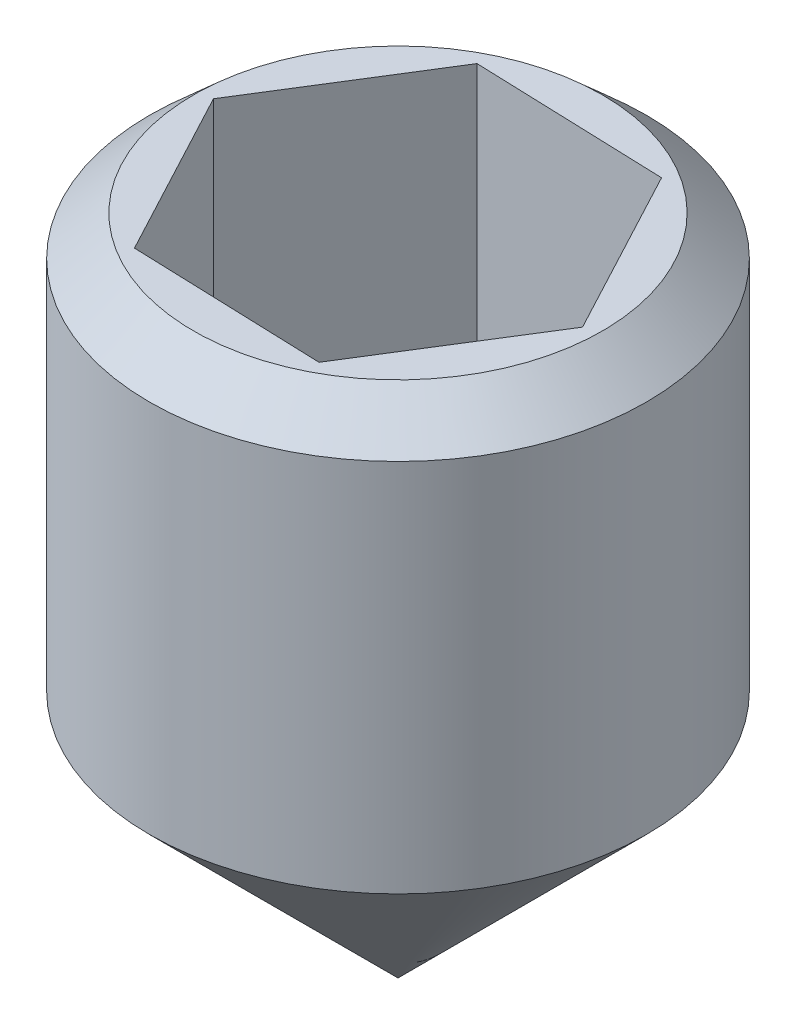
ISO-10303-21;
HEADER;
FILE_DESCRIPTION(('STEP AP214'),'2;1');
FILE_NAME('part.step','',(''),(''),'','','');
FILE_SCHEMA(('AUTOMOTIVE_DESIGN { 1 0 10303 214 1 1 1 1 }'));
ENDSEC;
DATA;
#1=APPLICATION_CONTEXT('core data for automotive mechanical design processes');
#2=APPLICATION_PROTOCOL_DEFINITION('international standard','automotive_design',2000,#1);
#3=PRODUCT_CONTEXT('',#1,'mechanical');
#4=PRODUCT('Part','Part','',(#3));
#5=PRODUCT_RELATED_PRODUCT_CATEGORY('part','',(#4));
#6=PRODUCT_DEFINITION_FORMATION('','',#4);
#7=PRODUCT_DEFINITION_CONTEXT('part definition',#1,'design');
#8=PRODUCT_DEFINITION('design','',#6,#7);
#9=PRODUCT_DEFINITION_SHAPE('','',#8);
#10=(LENGTH_UNIT() NAMED_UNIT(*) SI_UNIT(.MILLI.,.METRE.));
#11=(NAMED_UNIT(*) PLANE_ANGLE_UNIT() SI_UNIT($,.RADIAN.));
#12=(NAMED_UNIT(*) SI_UNIT($,.STERADIAN.) SOLID_ANGLE_UNIT());
#13=UNCERTAINTY_MEASURE_WITH_UNIT(LENGTH_MEASURE(1.E-05),#10,'distance_accuracy_value','');
#14=(GEOMETRIC_REPRESENTATION_CONTEXT(3) GLOBAL_UNCERTAINTY_ASSIGNED_CONTEXT((#13)) GLOBAL_UNIT_ASSIGNED_CONTEXT((#10,
#11,#12)) REPRESENTATION_CONTEXT('',''));
#15=CARTESIAN_POINT('',(0.,0.,0.));
#16=DIRECTION('',(0.,0.,1.));
#17=DIRECTION('',(1.,0.,0.));
#18=AXIS2_PLACEMENT_3D('',#15,#16,#17);
#19=CARTESIAN_POINT('',(0.,1.50000000000002,0.));
#20=DIRECTION('',(0.,1.,0.));
#21=DIRECTION('',(0.,0.,1.));
#22=AXIS2_PLACEMENT_3D('',#19,#20,#21);
#23=CONICAL_SURFACE('',#22,1.5,0.785398163397443);
#24=CARTESIAN_POINT('',(0.,0.,0.));
#25=VERTEX_POINT('',#24);
#26=VERTEX_LOOP('',#25);
#27=FACE_BOUND('',#26,.T.);
#28=CARTESIAN_POINT('',(0.,1.50000000000002,0.));
#29=DIRECTION('',(0.,-1.,0.));
#30=DIRECTION('',(0.,0.,-1.));
#31=AXIS2_PLACEMENT_3D('',#28,#29,#30);
#32=CIRCLE('',#31,1.5);
#33=CARTESIAN_POINT('',(0.,1.50000000000002,-1.5));
#34=VERTEX_POINT('',#33);
#35=EDGE_CURVE('E11',#34,#34,#32,.T.);
#36=ORIENTED_EDGE('',*,*,#35,.T.);
#37=EDGE_LOOP('',(#36));
#38=FACE_BOUND('',#37,.T.);
#39=ADVANCED_FACE('F34',(#27,#38),#23,.T.);
#40=CARTESIAN_POINT('',(0.,0.,0.));
#41=DIRECTION('',(0.,-1.,0.));
#42=DIRECTION('',(0.,0.,-1.));
#43=AXIS2_PLACEMENT_3D('',#40,#41,#42);
#44=CYLINDRICAL_SURFACE('',#43,1.5);
#45=ORIENTED_EDGE('',*,*,#35,.F.);
#46=EDGE_LOOP('',(#45));
#47=FACE_BOUND('',#46,.T.);
#48=CARTESIAN_POINT('',(0.,3.76109922814997,0.));
#49=DIRECTION('',(0.,-1.,0.));
#50=DIRECTION('',(0.,0.,-1.));
#51=AXIS2_PLACEMENT_3D('',#48,#49,#50);
#52=CIRCLE('',#51,1.5);
#53=CARTESIAN_POINT('',(0.,3.76109922814997,-1.5));
#54=VERTEX_POINT('',#53);
#55=EDGE_CURVE('E41',#54,#54,#52,.T.);
#56=ORIENTED_EDGE('',*,*,#55,.T.);
#57=EDGE_LOOP('',(#56));
#58=FACE_BOUND('',#57,.T.);
#59=ADVANCED_FACE('F145',(#47,#58),#44,.T.);
#60=CARTESIAN_POINT('',(0.,4.,0.));
#61=DIRECTION('',(0.,-1.,0.));
#62=DIRECTION('',(0.,0.,-1.));
#63=AXIS2_PLACEMENT_3D('',#60,#61,#62);
#64=CONICAL_SURFACE('',#63,1.23437713206306,0.838313722153326);
#65=ORIENTED_EDGE('',*,*,#55,.F.);
#66=EDGE_LOOP('',(#65));
#67=FACE_BOUND('',#66,.T.);
#68=CARTESIAN_POINT('',(0.,4.,0.));
#69=DIRECTION('',(0.,-1.,0.));
#70=DIRECTION('',(0.,0.,-1.));
#71=AXIS2_PLACEMENT_3D('',#68,#69,#70);
#72=CIRCLE('',#71,1.23437713206306);
#73=CARTESIAN_POINT('',(0.,4.,-1.23437713206306));
#74=VERTEX_POINT('',#73);
#75=EDGE_CURVE('E133',#74,#74,#72,.T.);
#76=ORIENTED_EDGE('',*,*,#75,.T.);
#77=EDGE_LOOP('',(#76));
#78=FACE_BOUND('',#77,.T.);
#79=ADVANCED_FACE('F147',(#67,#78),#64,.T.);
#80=CARTESIAN_POINT('',(0.,4.,0.));
#81=DIRECTION('',(0.,-1.,0.));
#82=DIRECTION('',(0.,0.,-1.));
#83=AXIS2_PLACEMENT_3D('',#80,#81,#82);
#84=PLANE('',#83);
#85=DIRECTION('',(0.999400957887726,0.,0.0346081691670691));
#86=VECTOR('',#85,1.);
#87=CARTESIAN_POINT('',(-0.611612581231917,4.,0.979419922102958));
#88=LINE('',#87,#86);
#89=CARTESIAN_POINT('',(-0.611612581231917,4.,0.979419922102958));
#90=VERTEX_POINT('',#89);
#91=CARTESIAN_POINT('',(0.542396242897779,4.,1.01938199367249));
#92=VERTEX_POINT('',#91);
#93=EDGE_CURVE('E121',#90,#92,#88,.T.);
#94=ORIENTED_EDGE('',*,*,#93,.F.);
#95=DIRECTION('',(0.469728925266712,0.,0.882810702680807));
#96=VECTOR('',#95,1.);
#97=CARTESIAN_POINT('',(-1.1540088241297,4.,-0.039962071569535));
#98=LINE('',#97,#96);
#99=CARTESIAN_POINT('',(-1.1540088241297,4.,-0.039962071569535));
#100=VERTEX_POINT('',#99);
#101=EDGE_CURVE('E48',#100,#90,#98,.T.);
#102=ORIENTED_EDGE('',*,*,#101,.F.);
#103=DIRECTION('',(-0.529672032621014,0.,0.848202533513738));
#104=VECTOR('',#103,1.);
#105=CARTESIAN_POINT('',(-0.542396242897779,4.,-1.01938199367249));
#106=LINE('',#105,#104);
#107=CARTESIAN_POINT('',(-0.542396242897779,4.,-1.01938199367249));
#108=VERTEX_POINT('',#107);
#109=EDGE_CURVE('E107',#108,#100,#106,.T.);
#110=ORIENTED_EDGE('',*,*,#109,.F.);
#111=DIRECTION('',(-0.999400957887726,0.,-0.034608169167069));
#112=VECTOR('',#111,1.);
#113=CARTESIAN_POINT('',(0.611612581231918,4.,-0.979419922102959));
#114=LINE('',#113,#112);
#115=CARTESIAN_POINT('',(0.611612581231918,4.,-0.979419922102959));
#116=VERTEX_POINT('',#115);
#117=EDGE_CURVE('E110',#116,#108,#114,.T.);
#118=ORIENTED_EDGE('',*,*,#117,.F.);
#119=DIRECTION('',(-0.469728925266712,0.,-0.882810702680807));
#120=VECTOR('',#119,1.);
#121=CARTESIAN_POINT('',(1.1540088241297,4.,0.039962071569535));
#122=LINE('',#121,#120);
#123=CARTESIAN_POINT('',(1.1540088241297,4.,0.039962071569535));
#124=VERTEX_POINT('',#123);
#125=EDGE_CURVE('E126',#124,#116,#122,.T.);
#126=ORIENTED_EDGE('',*,*,#125,.F.);
#127=DIRECTION('',(0.529672032621014,0.,-0.848202533513738));
#128=VECTOR('',#127,1.);
#129=CARTESIAN_POINT('',(0.542396242897779,4.,1.01938199367249));
#130=LINE('',#129,#128);
#131=EDGE_CURVE('E123',#92,#124,#130,.T.);
#132=ORIENTED_EDGE('',*,*,#131,.F.);
#133=EDGE_LOOP('',(#94,#102,#110,#118,#126,#132));
#134=FACE_BOUND('',#133,.T.);
#135=ORIENTED_EDGE('',*,*,#75,.F.);
#136=EDGE_LOOP('',(#135));
#137=FACE_BOUND('',#136,.T.);
#138=ADVANCED_FACE('F150',(#134,#137),#84,.F.);
#139=CARTESIAN_POINT('',(-1.1540088241297,2.,-0.039962071569535));
#140=DIRECTION('',(-0.882810702680807,0.,0.469728925266712));
#141=DIRECTION('',(0.469728925266712,0.,0.882810702680807));
#142=AXIS2_PLACEMENT_3D('',#139,#140,#141);
#143=PLANE('',#142);
#144=ORIENTED_EDGE('',*,*,#101,.T.);
#145=DIRECTION('',(0.,1.,0.));
#146=VECTOR('',#145,1.);
#147=CARTESIAN_POINT('',(-0.611612581231917,2.,0.979419922102958));
#148=LINE('',#147,#146);
#149=CARTESIAN_POINT('',(-0.611612581231917,2.,0.979419922102958));
#150=VERTEX_POINT('',#149);
#151=EDGE_CURVE('E84',#150,#90,#148,.T.);
#152=ORIENTED_EDGE('',*,*,#151,.F.);
#153=DIRECTION('',(0.469728925266712,0.,0.882810702680807));
#154=VECTOR('',#153,1.);
#155=CARTESIAN_POINT('',(-1.1540088241297,2.,-0.039962071569535));
#156=LINE('',#155,#154);
#157=CARTESIAN_POINT('',(-1.1540088241297,2.,-0.039962071569535));
#158=VERTEX_POINT('',#157);
#159=EDGE_CURVE('E88',#158,#150,#156,.T.);
#160=ORIENTED_EDGE('',*,*,#159,.F.);
#161=DIRECTION('',(0.,1.,0.));
#162=VECTOR('',#161,1.);
#163=CARTESIAN_POINT('',(-1.1540088241297,2.,-0.039962071569535));
#164=LINE('',#163,#162);
#165=EDGE_CURVE('E131',#158,#100,#164,.T.);
#166=ORIENTED_EDGE('',*,*,#165,.T.);
#167=EDGE_LOOP('',(#144,#152,#160,#166));
#168=FACE_BOUND('',#167,.T.);
#169=ADVANCED_FACE('F86',(#168),#143,.F.);
#170=CARTESIAN_POINT('',(-0.542396242897779,2.,-1.01938199367249));
#171=DIRECTION('',(-0.848202533513738,0.,-0.529672032621014));
#172=DIRECTION('',(-0.529672032621014,0.,0.848202533513738));
#173=AXIS2_PLACEMENT_3D('',#170,#171,#172);
#174=PLANE('',#173);
#175=ORIENTED_EDGE('',*,*,#109,.T.);
#176=ORIENTED_EDGE('',*,*,#165,.F.);
#177=DIRECTION('',(-0.529672032621014,0.,0.848202533513738));
#178=VECTOR('',#177,1.);
#179=CARTESIAN_POINT('',(-0.542396242897779,2.,-1.01938199367249));
#180=LINE('',#179,#178);
#181=CARTESIAN_POINT('',(-0.542396242897779,2.,-1.01938199367249));
#182=VERTEX_POINT('',#181);
#183=EDGE_CURVE('E94',#182,#158,#180,.T.);
#184=ORIENTED_EDGE('',*,*,#183,.F.);
#185=DIRECTION('',(0.,1.,0.));
#186=VECTOR('',#185,1.);
#187=CARTESIAN_POINT('',(-0.542396242897779,2.,-1.01938199367249));
#188=LINE('',#187,#186);
#189=EDGE_CURVE('E134',#182,#108,#188,.T.);
#190=ORIENTED_EDGE('',*,*,#189,.T.);
#191=EDGE_LOOP('',(#175,#176,#184,#190));
#192=FACE_BOUND('',#191,.T.);
#193=ADVANCED_FACE('F160',(#192),#174,.F.);
#194=CARTESIAN_POINT('',(0.611612581231918,2.,-0.979419922102959));
#195=DIRECTION('',(0.034608169167069,0.,-0.999400957887726));
#196=DIRECTION('',(-0.999400957887726,0.,-0.034608169167069));
#197=AXIS2_PLACEMENT_3D('',#194,#195,#196);
#198=PLANE('',#197);
#199=ORIENTED_EDGE('',*,*,#117,.T.);
#200=ORIENTED_EDGE('',*,*,#189,.F.);
#201=DIRECTION('',(-0.999400957887726,0.,-0.034608169167069));
#202=VECTOR('',#201,1.);
#203=CARTESIAN_POINT('',(0.611612581231918,2.,-0.979419922102959));
#204=LINE('',#203,#202);
#205=CARTESIAN_POINT('',(0.611612581231918,2.,-0.979419922102959));
#206=VERTEX_POINT('',#205);
#207=EDGE_CURVE('E117',#206,#182,#204,.T.);
#208=ORIENTED_EDGE('',*,*,#207,.F.);
#209=DIRECTION('',(0.,1.,0.));
#210=VECTOR('',#209,1.);
#211=CARTESIAN_POINT('',(0.611612581231918,2.,-0.979419922102959));
#212=LINE('',#211,#210);
#213=EDGE_CURVE('E136',#206,#116,#212,.T.);
#214=ORIENTED_EDGE('',*,*,#213,.T.);
#215=EDGE_LOOP('',(#199,#200,#208,#214));
#216=FACE_BOUND('',#215,.T.);
#217=ADVANCED_FACE('F194',(#216),#198,.F.);
#218=CARTESIAN_POINT('',(1.1540088241297,2.,0.039962071569535));
#219=DIRECTION('',(0.882810702680807,0.,-0.469728925266712));
#220=DIRECTION('',(-0.469728925266712,0.,-0.882810702680807));
#221=AXIS2_PLACEMENT_3D('',#218,#219,#220);
#222=PLANE('',#221);
#223=ORIENTED_EDGE('',*,*,#125,.T.);
#224=ORIENTED_EDGE('',*,*,#213,.F.);
#225=DIRECTION('',(-0.469728925266712,0.,-0.882810702680807));
#226=VECTOR('',#225,1.);
#227=CARTESIAN_POINT('',(1.1540088241297,2.,0.039962071569535));
#228=LINE('',#227,#226);
#229=CARTESIAN_POINT('',(1.1540088241297,2.,0.039962071569535));
#230=VERTEX_POINT('',#229);
#231=EDGE_CURVE('E114',#230,#206,#228,.T.);
#232=ORIENTED_EDGE('',*,*,#231,.F.);
#233=DIRECTION('',(0.,1.,0.));
#234=VECTOR('',#233,1.);
#235=CARTESIAN_POINT('',(1.1540088241297,2.,0.039962071569535));
#236=LINE('',#235,#234);
#237=EDGE_CURVE('E138',#230,#124,#236,.T.);
#238=ORIENTED_EDGE('',*,*,#237,.T.);
#239=EDGE_LOOP('',(#223,#224,#232,#238));
#240=FACE_BOUND('',#239,.T.);
#241=ADVANCED_FACE('F204',(#240),#222,.F.);
#242=CARTESIAN_POINT('',(0.542396242897779,2.,1.01938199367249));
#243=DIRECTION('',(0.848202533513738,0.,0.529672032621014));
#244=DIRECTION('',(0.529672032621014,0.,-0.848202533513738));
#245=AXIS2_PLACEMENT_3D('',#242,#243,#244);
#246=PLANE('',#245);
#247=ORIENTED_EDGE('',*,*,#131,.T.);
#248=ORIENTED_EDGE('',*,*,#237,.F.);
#249=DIRECTION('',(0.529672032621014,0.,-0.848202533513738));
#250=VECTOR('',#249,1.);
#251=CARTESIAN_POINT('',(0.542396242897779,2.,1.01938199367249));
#252=LINE('',#251,#250);
#253=CARTESIAN_POINT('',(0.542396242897779,2.,1.01938199367249));
#254=VERTEX_POINT('',#253);
#255=EDGE_CURVE('E102',#254,#230,#252,.T.);
#256=ORIENTED_EDGE('',*,*,#255,.F.);
#257=DIRECTION('',(0.,1.,0.));
#258=VECTOR('',#257,1.);
#259=CARTESIAN_POINT('',(0.542396242897779,2.,1.01938199367249));
#260=LINE('',#259,#258);
#261=EDGE_CURVE('E93',#254,#92,#260,.T.);
#262=ORIENTED_EDGE('',*,*,#261,.T.);
#263=EDGE_LOOP('',(#247,#248,#256,#262));
#264=FACE_BOUND('',#263,.T.);
#265=ADVANCED_FACE('F214',(#264),#246,.F.);
#266=CARTESIAN_POINT('',(-0.611612581231917,2.,0.979419922102958));
#267=DIRECTION('',(-0.0346081691670691,0.,0.999400957887726));
#268=DIRECTION('',(0.999400957887726,0.,0.0346081691670691));
#269=AXIS2_PLACEMENT_3D('',#266,#267,#268);
#270=PLANE('',#269);
#271=ORIENTED_EDGE('',*,*,#93,.T.);
#272=ORIENTED_EDGE('',*,*,#261,.F.);
#273=DIRECTION('',(0.999400957887726,0.,0.0346081691670691));
#274=VECTOR('',#273,1.);
#275=CARTESIAN_POINT('',(-0.611612581231917,2.,0.979419922102958));
#276=LINE('',#275,#274);
#277=EDGE_CURVE('E97',#150,#254,#276,.T.);
#278=ORIENTED_EDGE('',*,*,#277,.F.);
#279=ORIENTED_EDGE('',*,*,#151,.T.);
#280=EDGE_LOOP('',(#271,#272,#278,#279));
#281=FACE_BOUND('',#280,.T.);
#282=ADVANCED_FACE('F98',(#281),#270,.F.);
#283=CARTESIAN_POINT('',(0.,2.,0.));
#284=DIRECTION('',(0.,1.,0.));
#285=DIRECTION('',(0.,0.,1.));
#286=AXIS2_PLACEMENT_3D('',#283,#284,#285);
#287=PLANE('',#286);
#288=ORIENTED_EDGE('',*,*,#159,.T.);
#289=ORIENTED_EDGE('',*,*,#277,.T.);
#290=ORIENTED_EDGE('',*,*,#255,.T.);
#291=ORIENTED_EDGE('',*,*,#231,.T.);
#292=ORIENTED_EDGE('',*,*,#207,.T.);
#293=ORIENTED_EDGE('',*,*,#183,.T.);
#294=EDGE_LOOP('',(#288,#289,#290,#291,#292,#293));
#295=FACE_BOUND('',#294,.T.);
#296=ADVANCED_FACE('F104',(#295),#287,.T.);
#297=CLOSED_SHELL('',(#39,#59,#79,#138,#169,#193,#217,#241,#265,#282,#296));
#298=MANIFOLD_SOLID_BREP('B2',#297);
#299=ADVANCED_BREP_SHAPE_REPRESENTATION('',(#18,#298),#14);
#300=SHAPE_DEFINITION_REPRESENTATION(#9,#299);
ENDSEC;
END-ISO-10303-21;
